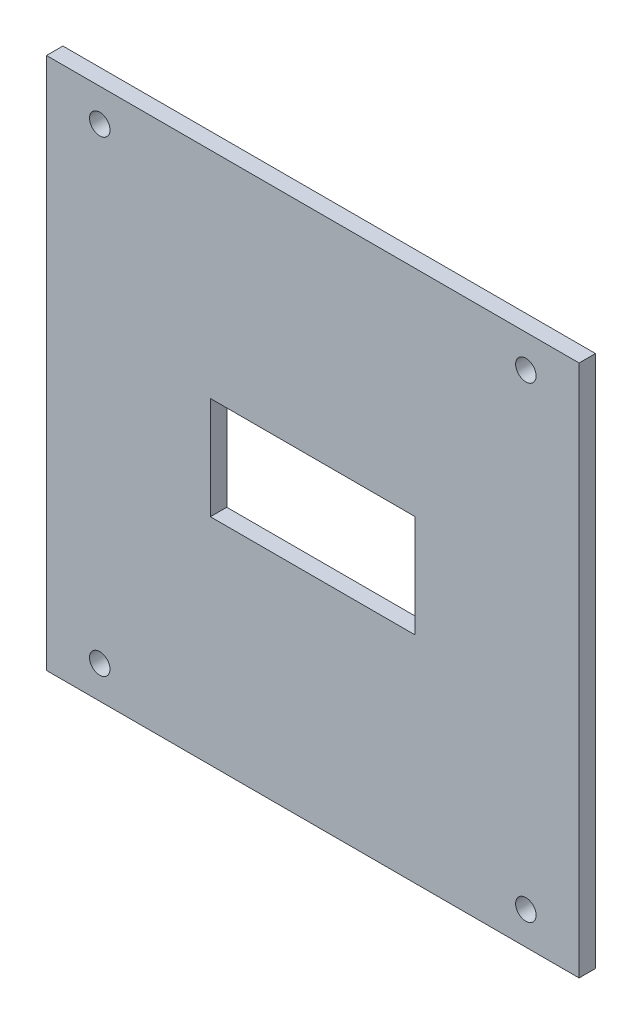
ISO-10303-21;
HEADER;
FILE_DESCRIPTION(('STEP AP214'),'2;1');
FILE_NAME('part.step','',(''),(''),'','','');
FILE_SCHEMA(('AUTOMOTIVE_DESIGN { 1 0 10303 214 1 1 1 1 }'));
ENDSEC;
DATA;
#1=APPLICATION_CONTEXT('core data for automotive mechanical design processes');
#2=APPLICATION_PROTOCOL_DEFINITION('international standard','automotive_design',2000,#1);
#3=PRODUCT_CONTEXT('',#1,'mechanical');
#4=PRODUCT('Part','Part','',(#3));
#5=PRODUCT_RELATED_PRODUCT_CATEGORY('part','',(#4));
#6=PRODUCT_DEFINITION_FORMATION('','',#4);
#7=PRODUCT_DEFINITION_CONTEXT('part definition',#1,'design');
#8=PRODUCT_DEFINITION('design','',#6,#7);
#9=PRODUCT_DEFINITION_SHAPE('','',#8);
#10=(LENGTH_UNIT() NAMED_UNIT(*) SI_UNIT(.MILLI.,.METRE.));
#11=(NAMED_UNIT(*) PLANE_ANGLE_UNIT() SI_UNIT($,.RADIAN.));
#12=(NAMED_UNIT(*) SI_UNIT($,.STERADIAN.) SOLID_ANGLE_UNIT());
#13=UNCERTAINTY_MEASURE_WITH_UNIT(LENGTH_MEASURE(1.E-05),#10,'distance_accuracy_value','');
#14=(GEOMETRIC_REPRESENTATION_CONTEXT(3) GLOBAL_UNCERTAINTY_ASSIGNED_CONTEXT((#13)) GLOBAL_UNIT_ASSIGNED_CONTEXT((#10,
#11,#12)) REPRESENTATION_CONTEXT('',''));
#15=CARTESIAN_POINT('',(0.,0.,0.));
#16=DIRECTION('',(0.,0.,1.));
#17=DIRECTION('',(1.,0.,0.));
#18=AXIS2_PLACEMENT_3D('',#15,#16,#17);
#19=CARTESIAN_POINT('',(-65.,-65.,-2.));
#20=DIRECTION('',(-1.,0.,0.));
#21=DIRECTION('',(0.,0.,1.));
#22=AXIS2_PLACEMENT_3D('',#19,#20,#21);
#23=PLANE('',#22);
#24=DIRECTION('',(0.,0.,1.));
#25=VECTOR('',#24,1.);
#26=CARTESIAN_POINT('',(-65.,-65.,-2.));
#27=LINE('',#26,#25);
#28=CARTESIAN_POINT('',(-65.,-65.,-2.));
#29=VERTEX_POINT('',#28);
#30=CARTESIAN_POINT('',(-65.,-65.,2.));
#31=VERTEX_POINT('',#30);
#32=EDGE_CURVE('E172',#29,#31,#27,.T.);
#33=ORIENTED_EDGE('',*,*,#32,.T.);
#34=DIRECTION('',(0.,-1.,0.));
#35=VECTOR('',#34,1.);
#36=CARTESIAN_POINT('',(-65.,-65.,2.));
#37=LINE('',#36,#35);
#38=CARTESIAN_POINT('',(-65.,65.,2.));
#39=VERTEX_POINT('',#38);
#40=EDGE_CURVE('E148',#39,#31,#37,.T.);
#41=ORIENTED_EDGE('',*,*,#40,.F.);
#42=DIRECTION('',(0.,0.,1.));
#43=VECTOR('',#42,1.);
#44=CARTESIAN_POINT('',(-65.,65.,-2.));
#45=LINE('',#44,#43);
#46=CARTESIAN_POINT('',(-65.,65.,-2.));
#47=VERTEX_POINT('',#46);
#48=EDGE_CURVE('E173',#47,#39,#45,.T.);
#49=ORIENTED_EDGE('',*,*,#48,.F.);
#50=DIRECTION('',(0.,-1.,0.));
#51=VECTOR('',#50,1.);
#52=CARTESIAN_POINT('',(-65.,-65.,-2.));
#53=LINE('',#52,#51);
#54=EDGE_CURVE('E160',#47,#29,#53,.T.);
#55=ORIENTED_EDGE('',*,*,#54,.T.);
#56=EDGE_LOOP('',(#33,#41,#49,#55));
#57=FACE_BOUND('',#56,.T.);
#58=ADVANCED_FACE('F33',(#57),#23,.T.);
#59=CARTESIAN_POINT('',(65.,65.,-2.));
#60=DIRECTION('',(0.,1.,0.));
#61=DIRECTION('',(0.,0.,1.));
#62=AXIS2_PLACEMENT_3D('',#59,#60,#61);
#63=PLANE('',#62);
#64=ORIENTED_EDGE('',*,*,#48,.T.);
#65=DIRECTION('',(-1.,0.,0.));
#66=VECTOR('',#65,1.);
#67=CARTESIAN_POINT('',(65.,65.,2.));
#68=LINE('',#67,#66);
#69=CARTESIAN_POINT('',(65.,65.,2.));
#70=VERTEX_POINT('',#69);
#71=EDGE_CURVE('E157',#70,#39,#68,.T.);
#72=ORIENTED_EDGE('',*,*,#71,.F.);
#73=DIRECTION('',(0.,0.,1.));
#74=VECTOR('',#73,1.);
#75=CARTESIAN_POINT('',(65.,65.,-2.));
#76=LINE('',#75,#74);
#77=CARTESIAN_POINT('',(65.,65.,-2.));
#78=VERTEX_POINT('',#77);
#79=EDGE_CURVE('E176',#78,#70,#76,.T.);
#80=ORIENTED_EDGE('',*,*,#79,.F.);
#81=DIRECTION('',(-1.,0.,0.));
#82=VECTOR('',#81,1.);
#83=CARTESIAN_POINT('',(65.,65.,-2.));
#84=LINE('',#83,#82);
#85=EDGE_CURVE('E169',#78,#47,#84,.T.);
#86=ORIENTED_EDGE('',*,*,#85,.T.);
#87=EDGE_LOOP('',(#64,#72,#80,#86));
#88=FACE_BOUND('',#87,.T.);
#89=ADVANCED_FACE('F204',(#88),#63,.T.);
#90=CARTESIAN_POINT('',(65.,-65.,-2.));
#91=DIRECTION('',(1.,0.,0.));
#92=DIRECTION('',(0.,0.,-1.));
#93=AXIS2_PLACEMENT_3D('',#90,#91,#92);
#94=PLANE('',#93);
#95=ORIENTED_EDGE('',*,*,#79,.T.);
#96=DIRECTION('',(0.,1.,0.));
#97=VECTOR('',#96,1.);
#98=CARTESIAN_POINT('',(65.,-65.,2.));
#99=LINE('',#98,#97);
#100=CARTESIAN_POINT('',(65.,-65.,2.));
#101=VERTEX_POINT('',#100);
#102=EDGE_CURVE('E154',#101,#70,#99,.T.);
#103=ORIENTED_EDGE('',*,*,#102,.F.);
#104=DIRECTION('',(0.,0.,1.));
#105=VECTOR('',#104,1.);
#106=CARTESIAN_POINT('',(65.,-65.,-2.));
#107=LINE('',#106,#105);
#108=CARTESIAN_POINT('',(65.,-65.,-2.));
#109=VERTEX_POINT('',#108);
#110=EDGE_CURVE('E178',#109,#101,#107,.T.);
#111=ORIENTED_EDGE('',*,*,#110,.F.);
#112=DIRECTION('',(0.,1.,0.));
#113=VECTOR('',#112,1.);
#114=CARTESIAN_POINT('',(65.,-65.,-2.));
#115=LINE('',#114,#113);
#116=EDGE_CURVE('E166',#109,#78,#115,.T.);
#117=ORIENTED_EDGE('',*,*,#116,.T.);
#118=EDGE_LOOP('',(#95,#103,#111,#117));
#119=FACE_BOUND('',#118,.T.);
#120=ADVANCED_FACE('F209',(#119),#94,.T.);
#121=CARTESIAN_POINT('',(65.,-65.,-2.));
#122=DIRECTION('',(0.,-1.,0.));
#123=DIRECTION('',(1.,0.,0.));
#124=AXIS2_PLACEMENT_3D('',#121,#122,#123);
#125=PLANE('',#124);
#126=ORIENTED_EDGE('',*,*,#110,.T.);
#127=DIRECTION('',(1.,0.,0.));
#128=VECTOR('',#127,1.);
#129=CARTESIAN_POINT('',(65.,-65.,2.));
#130=LINE('',#129,#128);
#131=EDGE_CURVE('E151',#31,#101,#130,.T.);
#132=ORIENTED_EDGE('',*,*,#131,.F.);
#133=ORIENTED_EDGE('',*,*,#32,.F.);
#134=DIRECTION('',(1.,0.,0.));
#135=VECTOR('',#134,1.);
#136=CARTESIAN_POINT('',(65.,-65.,-2.));
#137=LINE('',#136,#135);
#138=EDGE_CURVE('E163',#29,#109,#137,.T.);
#139=ORIENTED_EDGE('',*,*,#138,.T.);
#140=EDGE_LOOP('',(#126,#132,#133,#139));
#141=FACE_BOUND('',#140,.T.);
#142=ADVANCED_FACE('F217',(#141),#125,.T.);
#143=CARTESIAN_POINT('',(0.,0.,-2.));
#144=DIRECTION('',(0.,0.,1.));
#145=DIRECTION('',(1.,0.,0.));
#146=AXIS2_PLACEMENT_3D('',#143,#144,#145);
#147=PLANE('',#146);
#148=DIRECTION('',(-1.,0.,0.));
#149=VECTOR('',#148,1.);
#150=CARTESIAN_POINT('',(-25.,-12.5,-2.));
#151=LINE('',#150,#149);
#152=CARTESIAN_POINT('',(25.,-12.5,-2.));
#153=VERTEX_POINT('',#152);
#154=CARTESIAN_POINT('',(-25.,-12.5,-2.));
#155=VERTEX_POINT('',#154);
#156=EDGE_CURVE('E108',#153,#155,#151,.T.);
#157=ORIENTED_EDGE('',*,*,#156,.F.);
#158=DIRECTION('',(0.,-1.,0.));
#159=VECTOR('',#158,1.);
#160=CARTESIAN_POINT('',(25.,-12.5,-2.));
#161=LINE('',#160,#159);
#162=CARTESIAN_POINT('',(25.,12.5,-2.));
#163=VERTEX_POINT('',#162);
#164=EDGE_CURVE('E47',#163,#153,#161,.T.);
#165=ORIENTED_EDGE('',*,*,#164,.F.);
#166=DIRECTION('',(1.,0.,0.));
#167=VECTOR('',#166,1.);
#168=CARTESIAN_POINT('',(-25.,12.5,-2.));
#169=LINE('',#168,#167);
#170=CARTESIAN_POINT('',(-25.,12.5,-2.));
#171=VERTEX_POINT('',#170);
#172=EDGE_CURVE('E115',#171,#163,#169,.T.);
#173=ORIENTED_EDGE('',*,*,#172,.F.);
#174=DIRECTION('',(0.,1.,0.));
#175=VECTOR('',#174,1.);
#176=CARTESIAN_POINT('',(-25.,-12.5,-2.));
#177=LINE('',#176,#175);
#178=EDGE_CURVE('E99',#155,#171,#177,.T.);
#179=ORIENTED_EDGE('',*,*,#178,.F.);
#180=EDGE_LOOP('',(#157,#165,#173,#179));
#181=FACE_BOUND('',#180,.T.);
#182=CARTESIAN_POINT('',(52.,57.,-2.));
#183=DIRECTION('',(0.,0.,-1.));
#184=DIRECTION('',(-1.,0.,0.));
#185=AXIS2_PLACEMENT_3D('',#182,#183,#184);
#186=CIRCLE('',#185,2.49999999999999);
#187=CARTESIAN_POINT('',(49.5,57.,-2.));
#188=VERTEX_POINT('',#187);
#189=EDGE_CURVE('E122',#188,#188,#186,.T.);
#190=ORIENTED_EDGE('',*,*,#189,.F.);
#191=EDGE_LOOP('',(#190));
#192=FACE_BOUND('',#191,.T.);
#193=CARTESIAN_POINT('',(-52.,57.,-2.));
#194=DIRECTION('',(0.,0.,-1.));
#195=DIRECTION('',(-1.,0.,0.));
#196=AXIS2_PLACEMENT_3D('',#193,#194,#195);
#197=CIRCLE('',#196,2.49999999999999);
#198=CARTESIAN_POINT('',(-54.4999999999999,57.,-2.));
#199=VERTEX_POINT('',#198);
#200=EDGE_CURVE('E130',#199,#199,#197,.T.);
#201=ORIENTED_EDGE('',*,*,#200,.F.);
#202=EDGE_LOOP('',(#201));
#203=FACE_BOUND('',#202,.T.);
#204=CARTESIAN_POINT('',(-51.9999999999999,-57.,-2.));
#205=DIRECTION('',(0.,0.,-1.));
#206=DIRECTION('',(-1.,0.,0.));
#207=AXIS2_PLACEMENT_3D('',#204,#205,#206);
#208=CIRCLE('',#207,2.49999999999999);
#209=CARTESIAN_POINT('',(-54.4999999999999,-57.,-2.));
#210=VERTEX_POINT('',#209);
#211=EDGE_CURVE('E136',#210,#210,#208,.T.);
#212=ORIENTED_EDGE('',*,*,#211,.F.);
#213=EDGE_LOOP('',(#212));
#214=FACE_BOUND('',#213,.T.);
#215=CARTESIAN_POINT('',(52.,-57.,-2.));
#216=DIRECTION('',(0.,0.,-1.));
#217=DIRECTION('',(-1.,0.,0.));
#218=AXIS2_PLACEMENT_3D('',#215,#216,#217);
#219=CIRCLE('',#218,2.49999999999999);
#220=CARTESIAN_POINT('',(49.5,-57.,-2.));
#221=VERTEX_POINT('',#220);
#222=EDGE_CURVE('E142',#221,#221,#219,.T.);
#223=ORIENTED_EDGE('',*,*,#222,.F.);
#224=EDGE_LOOP('',(#223));
#225=FACE_BOUND('',#224,.T.);
#226=ORIENTED_EDGE('',*,*,#54,.F.);
#227=ORIENTED_EDGE('',*,*,#85,.F.);
#228=ORIENTED_EDGE('',*,*,#116,.F.);
#229=ORIENTED_EDGE('',*,*,#138,.F.);
#230=EDGE_LOOP('',(#226,#227,#228,#229));
#231=FACE_BOUND('',#230,.T.);
#232=ADVANCED_FACE('F112',(#181,#192,#203,#214,#225,#231),#147,.F.);
#233=CARTESIAN_POINT('',(0.,0.,2.));
#234=DIRECTION('',(0.,0.,1.));
#235=DIRECTION('',(1.,0.,0.));
#236=AXIS2_PLACEMENT_3D('',#233,#234,#235);
#237=PLANE('',#236);
#238=DIRECTION('',(0.,1.,0.));
#239=VECTOR('',#238,1.);
#240=CARTESIAN_POINT('',(25.,0.,2.));
#241=LINE('',#240,#239);
#242=CARTESIAN_POINT('',(25.,-12.5,2.));
#243=VERTEX_POINT('',#242);
#244=CARTESIAN_POINT('',(25.,12.5,2.));
#245=VERTEX_POINT('',#244);
#246=EDGE_CURVE('E11',#243,#245,#241,.T.);
#247=ORIENTED_EDGE('',*,*,#246,.F.);
#248=DIRECTION('',(1.,0.,0.));
#249=VECTOR('',#248,1.);
#250=CARTESIAN_POINT('',(0.,-12.5,2.));
#251=LINE('',#250,#249);
#252=CARTESIAN_POINT('',(-25.,-12.5,2.));
#253=VERTEX_POINT('',#252);
#254=EDGE_CURVE('E175',#253,#243,#251,.T.);
#255=ORIENTED_EDGE('',*,*,#254,.F.);
#256=DIRECTION('',(0.,-1.,0.));
#257=VECTOR('',#256,1.);
#258=CARTESIAN_POINT('',(-25.,0.,2.));
#259=LINE('',#258,#257);
#260=CARTESIAN_POINT('',(-25.,12.5,2.));
#261=VERTEX_POINT('',#260);
#262=EDGE_CURVE('E102',#261,#253,#259,.T.);
#263=ORIENTED_EDGE('',*,*,#262,.F.);
#264=DIRECTION('',(-1.,0.,0.));
#265=VECTOR('',#264,1.);
#266=CARTESIAN_POINT('',(0.,12.5,2.));
#267=LINE('',#266,#265);
#268=EDGE_CURVE('E40',#245,#261,#267,.T.);
#269=ORIENTED_EDGE('',*,*,#268,.F.);
#270=EDGE_LOOP('',(#247,#255,#263,#269));
#271=FACE_BOUND('',#270,.T.);
#272=CARTESIAN_POINT('',(52.,57.,2.));
#273=DIRECTION('',(0.,0.,-1.));
#274=DIRECTION('',(-1.,0.,0.));
#275=AXIS2_PLACEMENT_3D('',#272,#273,#274);
#276=CIRCLE('',#275,2.5);
#277=CARTESIAN_POINT('',(49.5,57.,2.));
#278=VERTEX_POINT('',#277);
#279=EDGE_CURVE('E127',#278,#278,#276,.T.);
#280=ORIENTED_EDGE('',*,*,#279,.T.);
#281=EDGE_LOOP('',(#280));
#282=FACE_BOUND('',#281,.T.);
#283=CARTESIAN_POINT('',(-52.,57.,2.));
#284=DIRECTION('',(0.,0.,-1.));
#285=DIRECTION('',(-1.,0.,0.));
#286=AXIS2_PLACEMENT_3D('',#283,#284,#285);
#287=CIRCLE('',#286,2.5);
#288=CARTESIAN_POINT('',(-54.5,57.,2.));
#289=VERTEX_POINT('',#288);
#290=EDGE_CURVE('E133',#289,#289,#287,.T.);
#291=ORIENTED_EDGE('',*,*,#290,.T.);
#292=EDGE_LOOP('',(#291));
#293=FACE_BOUND('',#292,.T.);
#294=CARTESIAN_POINT('',(-51.9999999999999,-57.,2.));
#295=DIRECTION('',(0.,0.,-1.));
#296=DIRECTION('',(-1.,0.,0.));
#297=AXIS2_PLACEMENT_3D('',#294,#295,#296);
#298=CIRCLE('',#297,2.5);
#299=CARTESIAN_POINT('',(-54.4999999999999,-57.,2.));
#300=VERTEX_POINT('',#299);
#301=EDGE_CURVE('E139',#300,#300,#298,.T.);
#302=ORIENTED_EDGE('',*,*,#301,.T.);
#303=EDGE_LOOP('',(#302));
#304=FACE_BOUND('',#303,.T.);
#305=CARTESIAN_POINT('',(52.,-57.,2.));
#306=DIRECTION('',(0.,0.,-1.));
#307=DIRECTION('',(-1.,0.,0.));
#308=AXIS2_PLACEMENT_3D('',#305,#306,#307);
#309=CIRCLE('',#308,2.5);
#310=CARTESIAN_POINT('',(49.5,-57.,2.));
#311=VERTEX_POINT('',#310);
#312=EDGE_CURVE('E145',#311,#311,#309,.T.);
#313=ORIENTED_EDGE('',*,*,#312,.T.);
#314=EDGE_LOOP('',(#313));
#315=FACE_BOUND('',#314,.T.);
#316=ORIENTED_EDGE('',*,*,#40,.T.);
#317=ORIENTED_EDGE('',*,*,#131,.T.);
#318=ORIENTED_EDGE('',*,*,#102,.T.);
#319=ORIENTED_EDGE('',*,*,#71,.T.);
#320=EDGE_LOOP('',(#316,#317,#318,#319));
#321=FACE_BOUND('',#320,.T.);
#322=ADVANCED_FACE('F188',(#271,#282,#293,#304,#315,#321),#237,.T.);
#323=CARTESIAN_POINT('',(52.,-57.,-2.));
#324=DIRECTION('',(0.,0.,-1.));
#325=DIRECTION('',(-1.,0.,0.));
#326=AXIS2_PLACEMENT_3D('',#323,#324,#325);
#327=CYLINDRICAL_SURFACE('',#326,2.5);
#328=ORIENTED_EDGE('',*,*,#312,.F.);
#329=EDGE_LOOP('',(#328));
#330=FACE_BOUND('',#329,.T.);
#331=ORIENTED_EDGE('',*,*,#222,.T.);
#332=EDGE_LOOP('',(#331));
#333=FACE_BOUND('',#332,.T.);
#334=ADVANCED_FACE('F235',(#330,#333),#327,.F.);
#335=CARTESIAN_POINT('',(-51.9999999999999,-57.,-2.));
#336=DIRECTION('',(0.,0.,-1.));
#337=DIRECTION('',(-1.,0.,0.));
#338=AXIS2_PLACEMENT_3D('',#335,#336,#337);
#339=CYLINDRICAL_SURFACE('',#338,2.5);
#340=ORIENTED_EDGE('',*,*,#301,.F.);
#341=EDGE_LOOP('',(#340));
#342=FACE_BOUND('',#341,.T.);
#343=ORIENTED_EDGE('',*,*,#211,.T.);
#344=EDGE_LOOP('',(#343));
#345=FACE_BOUND('',#344,.T.);
#346=ADVANCED_FACE('F238',(#342,#345),#339,.F.);
#347=CARTESIAN_POINT('',(-52.,57.,-2.));
#348=DIRECTION('',(0.,0.,-1.));
#349=DIRECTION('',(-1.,0.,0.));
#350=AXIS2_PLACEMENT_3D('',#347,#348,#349);
#351=CYLINDRICAL_SURFACE('',#350,2.5);
#352=ORIENTED_EDGE('',*,*,#290,.F.);
#353=EDGE_LOOP('',(#352));
#354=FACE_BOUND('',#353,.T.);
#355=ORIENTED_EDGE('',*,*,#200,.T.);
#356=EDGE_LOOP('',(#355));
#357=FACE_BOUND('',#356,.T.);
#358=ADVANCED_FACE('F199',(#354,#357),#351,.F.);
#359=CARTESIAN_POINT('',(52.,57.,-2.));
#360=DIRECTION('',(0.,0.,-1.));
#361=DIRECTION('',(-1.,0.,0.));
#362=AXIS2_PLACEMENT_3D('',#359,#360,#361);
#363=CYLINDRICAL_SURFACE('',#362,2.5);
#364=ORIENTED_EDGE('',*,*,#279,.F.);
#365=EDGE_LOOP('',(#364));
#366=FACE_BOUND('',#365,.T.);
#367=ORIENTED_EDGE('',*,*,#189,.T.);
#368=EDGE_LOOP('',(#367));
#369=FACE_BOUND('',#368,.T.);
#370=ADVANCED_FACE('F192',(#366,#369),#363,.F.);
#371=CARTESIAN_POINT('',(25.,-12.5,18.));
#372=DIRECTION('',(1.,0.,0.));
#373=DIRECTION('',(0.,0.,-1.));
#374=AXIS2_PLACEMENT_3D('',#371,#372,#373);
#375=PLANE('',#374);
#376=ORIENTED_EDGE('',*,*,#246,.T.);
#377=DIRECTION('',(0.,0.,-1.));
#378=VECTOR('',#377,1.);
#379=CARTESIAN_POINT('',(25.,12.5,18.));
#380=LINE('',#379,#378);
#381=EDGE_CURVE('E120',#245,#163,#380,.T.);
#382=ORIENTED_EDGE('',*,*,#381,.T.);
#383=ORIENTED_EDGE('',*,*,#164,.T.);
#384=DIRECTION('',(0.,0.,-1.));
#385=VECTOR('',#384,1.);
#386=CARTESIAN_POINT('',(25.,-12.5,18.));
#387=LINE('',#386,#385);
#388=EDGE_CURVE('E105',#243,#153,#387,.T.);
#389=ORIENTED_EDGE('',*,*,#388,.F.);
#390=EDGE_LOOP('',(#376,#382,#383,#389));
#391=FACE_BOUND('',#390,.T.);
#392=ADVANCED_FACE('F190',(#391),#375,.F.);
#393=CARTESIAN_POINT('',(-25.,12.5,18.));
#394=DIRECTION('',(0.,1.,0.));
#395=DIRECTION('',(-1.,0.,0.));
#396=AXIS2_PLACEMENT_3D('',#393,#394,#395);
#397=PLANE('',#396);
#398=ORIENTED_EDGE('',*,*,#268,.T.);
#399=DIRECTION('',(0.,0.,-1.));
#400=VECTOR('',#399,1.);
#401=CARTESIAN_POINT('',(-25.,12.5,18.));
#402=LINE('',#401,#400);
#403=EDGE_CURVE('E104',#261,#171,#402,.T.);
#404=ORIENTED_EDGE('',*,*,#403,.T.);
#405=ORIENTED_EDGE('',*,*,#172,.T.);
#406=ORIENTED_EDGE('',*,*,#381,.F.);
#407=EDGE_LOOP('',(#398,#404,#405,#406));
#408=FACE_BOUND('',#407,.T.);
#409=ADVANCED_FACE('F185',(#408),#397,.F.);
#410=CARTESIAN_POINT('',(-25.,-12.5,18.));
#411=DIRECTION('',(-1.,0.,0.));
#412=DIRECTION('',(0.,0.,1.));
#413=AXIS2_PLACEMENT_3D('',#410,#411,#412);
#414=PLANE('',#413);
#415=ORIENTED_EDGE('',*,*,#262,.T.);
#416=DIRECTION('',(0.,0.,-1.));
#417=VECTOR('',#416,1.);
#418=CARTESIAN_POINT('',(-25.,-12.5,18.));
#419=LINE('',#418,#417);
#420=EDGE_CURVE('E55',#253,#155,#419,.T.);
#421=ORIENTED_EDGE('',*,*,#420,.T.);
#422=ORIENTED_EDGE('',*,*,#178,.T.);
#423=ORIENTED_EDGE('',*,*,#403,.F.);
#424=EDGE_LOOP('',(#415,#421,#422,#423));
#425=FACE_BOUND('',#424,.T.);
#426=ADVANCED_FACE('F96',(#425),#414,.F.);
#427=CARTESIAN_POINT('',(-25.,-12.5,18.));
#428=DIRECTION('',(0.,-1.,0.));
#429=DIRECTION('',(1.,0.,0.));
#430=AXIS2_PLACEMENT_3D('',#427,#428,#429);
#431=PLANE('',#430);
#432=ORIENTED_EDGE('',*,*,#254,.T.);
#433=ORIENTED_EDGE('',*,*,#388,.T.);
#434=ORIENTED_EDGE('',*,*,#156,.T.);
#435=ORIENTED_EDGE('',*,*,#420,.F.);
#436=EDGE_LOOP('',(#432,#433,#434,#435));
#437=FACE_BOUND('',#436,.T.);
#438=ADVANCED_FACE('F109',(#437),#431,.F.);
#439=CLOSED_SHELL('',(#58,#89,#120,#142,#232,#322,#334,#346,#358,#370,#392,#409,#426,#438));
#440=MANIFOLD_SOLID_BREP('B2',#439);
#441=ADVANCED_BREP_SHAPE_REPRESENTATION('',(#18,#440),#14);
#442=SHAPE_DEFINITION_REPRESENTATION(#9,#441);
ENDSEC;
END-ISO-10303-21;
